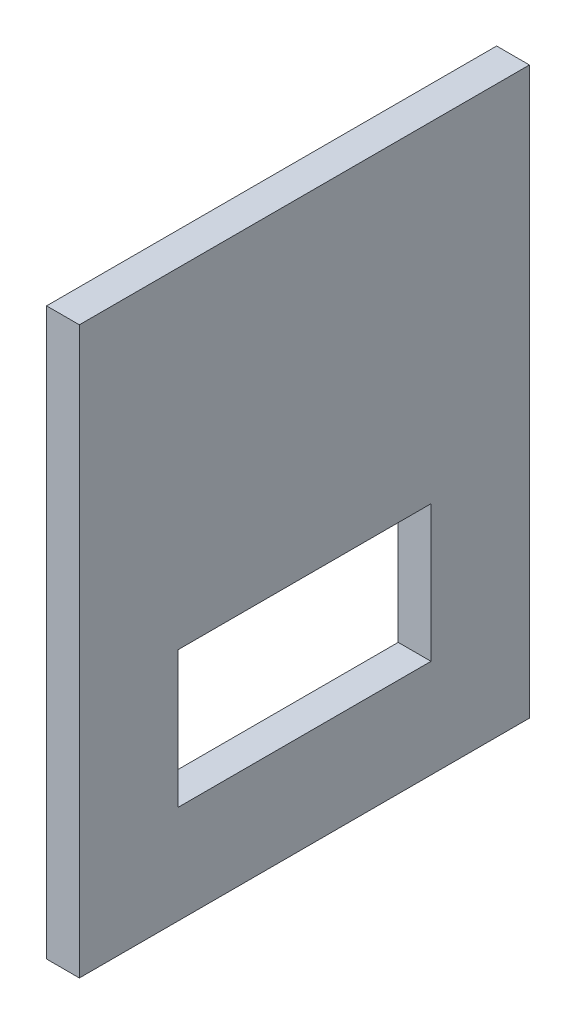
ISO-10303-21;
HEADER;
FILE_DESCRIPTION(('STEP AP214'),'2;1');
FILE_NAME('part.step','',(''),(''),'','','');
FILE_SCHEMA(('AUTOMOTIVE_DESIGN { 1 0 10303 214 1 1 1 1 }'));
ENDSEC;
DATA;
#1=APPLICATION_CONTEXT('core data for automotive mechanical design processes');
#2=APPLICATION_PROTOCOL_DEFINITION('international standard','automotive_design',2000,#1);
#3=PRODUCT_CONTEXT('',#1,'mechanical');
#4=PRODUCT('Part','Part','',(#3));
#5=PRODUCT_RELATED_PRODUCT_CATEGORY('part','',(#4));
#6=PRODUCT_DEFINITION_FORMATION('','',#4);
#7=PRODUCT_DEFINITION_CONTEXT('part definition',#1,'design');
#8=PRODUCT_DEFINITION('design','',#6,#7);
#9=PRODUCT_DEFINITION_SHAPE('','',#8);
#10=(LENGTH_UNIT() NAMED_UNIT(*) SI_UNIT(.MILLI.,.METRE.));
#11=(NAMED_UNIT(*) PLANE_ANGLE_UNIT() SI_UNIT($,.RADIAN.));
#12=(NAMED_UNIT(*) SI_UNIT($,.STERADIAN.) SOLID_ANGLE_UNIT());
#13=UNCERTAINTY_MEASURE_WITH_UNIT(LENGTH_MEASURE(1.E-05),#10,'distance_accuracy_value','');
#14=(GEOMETRIC_REPRESENTATION_CONTEXT(3) GLOBAL_UNCERTAINTY_ASSIGNED_CONTEXT((#13)) GLOBAL_UNIT_ASSIGNED_CONTEXT((#10,
#11,#12)) REPRESENTATION_CONTEXT('',''));
#15=CARTESIAN_POINT('',(0.,0.,0.));
#16=DIRECTION('',(0.,0.,1.));
#17=DIRECTION('',(1.,0.,0.));
#18=AXIS2_PLACEMENT_3D('',#15,#16,#17);
#19=CARTESIAN_POINT('',(0.,0.,68.58));
#20=DIRECTION('',(1.,0.,0.));
#21=DIRECTION('',(0.,0.,-1.));
#22=AXIS2_PLACEMENT_3D('',#19,#20,#21);
#23=PLANE('',#22);
#24=DIRECTION('',(0.,0.,1.));
#25=VECTOR('',#24,1.);
#26=CARTESIAN_POINT('',(0.,15.,15.));
#27=LINE('',#26,#25);
#28=CARTESIAN_POINT('',(0.,15.,15.));
#29=VERTEX_POINT('',#28);
#30=CARTESIAN_POINT('',(0.,15.,53.58));
#31=VERTEX_POINT('',#30);
#32=EDGE_CURVE('E124',#29,#31,#27,.T.);
#33=ORIENTED_EDGE('',*,*,#32,.F.);
#34=DIRECTION('',(0.,-1.,0.));
#35=VECTOR('',#34,1.);
#36=CARTESIAN_POINT('',(0.,15.,15.));
#37=LINE('',#36,#35);
#38=CARTESIAN_POINT('',(0.,35.8,15.));
#39=VERTEX_POINT('',#38);
#40=EDGE_CURVE('E47',#39,#29,#37,.T.);
#41=ORIENTED_EDGE('',*,*,#40,.F.);
#42=DIRECTION('',(0.,0.,-1.));
#43=VECTOR('',#42,1.);
#44=CARTESIAN_POINT('',(0.,35.8,15.));
#45=LINE('',#44,#43);
#46=CARTESIAN_POINT('',(0.,35.8,53.58));
#47=VERTEX_POINT('',#46);
#48=EDGE_CURVE('E115',#47,#39,#45,.T.);
#49=ORIENTED_EDGE('',*,*,#48,.F.);
#50=DIRECTION('',(0.,1.,0.));
#51=VECTOR('',#50,1.);
#52=CARTESIAN_POINT('',(0.,15.,53.58));
#53=LINE('',#52,#51);
#54=EDGE_CURVE('E118',#31,#47,#53,.T.);
#55=ORIENTED_EDGE('',*,*,#54,.F.);
#56=EDGE_LOOP('',(#33,#41,#49,#55));
#57=FACE_BOUND('',#56,.T.);
#58=DIRECTION('',(0.,-1.,0.));
#59=VECTOR('',#58,1.);
#60=CARTESIAN_POINT('',(0.,0.,0.));
#61=LINE('',#60,#59);
#62=CARTESIAN_POINT('',(0.,86.2,0.));
#63=VERTEX_POINT('',#62);
#64=CARTESIAN_POINT('',(0.,0.,0.));
#65=VERTEX_POINT('',#64);
#66=EDGE_CURVE('E130',#63,#65,#61,.T.);
#67=ORIENTED_EDGE('',*,*,#66,.T.);
#68=DIRECTION('',(0.,0.,-1.));
#69=VECTOR('',#68,1.);
#70=CARTESIAN_POINT('',(0.,0.,68.58));
#71=LINE('',#70,#69);
#72=CARTESIAN_POINT('',(0.,0.,68.58));
#73=VERTEX_POINT('',#72);
#74=EDGE_CURVE('E11',#73,#65,#71,.T.);
#75=ORIENTED_EDGE('',*,*,#74,.F.);
#76=DIRECTION('',(0.,-1.,0.));
#77=VECTOR('',#76,1.);
#78=CARTESIAN_POINT('',(0.,0.,68.58));
#79=LINE('',#78,#77);
#80=CARTESIAN_POINT('',(0.,86.2,68.58));
#81=VERTEX_POINT('',#80);
#82=EDGE_CURVE('E134',#81,#73,#79,.T.);
#83=ORIENTED_EDGE('',*,*,#82,.F.);
#84=DIRECTION('',(0.,0.,-1.));
#85=VECTOR('',#84,1.);
#86=CARTESIAN_POINT('',(0.,86.2,68.58));
#87=LINE('',#86,#85);
#88=EDGE_CURVE('E144',#81,#63,#87,.T.);
#89=ORIENTED_EDGE('',*,*,#88,.T.);
#90=EDGE_LOOP('',(#67,#75,#83,#89));
#91=FACE_BOUND('',#90,.T.);
#92=ADVANCED_FACE('F33',(#57,#91),#23,.F.);
#93=CARTESIAN_POINT('',(0.,0.,68.58));
#94=DIRECTION('',(0.,1.,0.));
#95=DIRECTION('',(0.,0.,1.));
#96=AXIS2_PLACEMENT_3D('',#93,#94,#95);
#97=PLANE('',#96);
#98=DIRECTION('',(1.,0.,0.));
#99=VECTOR('',#98,1.);
#100=CARTESIAN_POINT('',(0.,0.,0.));
#101=LINE('',#100,#99);
#102=CARTESIAN_POINT('',(5.,0.,0.));
#103=VERTEX_POINT('',#102);
#104=EDGE_CURVE('E147',#65,#103,#101,.T.);
#105=ORIENTED_EDGE('',*,*,#104,.T.);
#106=DIRECTION('',(0.,0.,-1.));
#107=VECTOR('',#106,1.);
#108=CARTESIAN_POINT('',(5.,0.,68.58));
#109=LINE('',#108,#107);
#110=CARTESIAN_POINT('',(5.,0.,68.58));
#111=VERTEX_POINT('',#110);
#112=EDGE_CURVE('E40',#111,#103,#109,.T.);
#113=ORIENTED_EDGE('',*,*,#112,.F.);
#114=DIRECTION('',(1.,0.,0.));
#115=VECTOR('',#114,1.);
#116=CARTESIAN_POINT('',(0.,0.,68.58));
#117=LINE('',#116,#115);
#118=EDGE_CURVE('E137',#73,#111,#117,.T.);
#119=ORIENTED_EDGE('',*,*,#118,.F.);
#120=ORIENTED_EDGE('',*,*,#74,.T.);
#121=EDGE_LOOP('',(#105,#113,#119,#120));
#122=FACE_BOUND('',#121,.T.);
#123=ADVANCED_FACE('F175',(#122),#97,.F.);
#124=CARTESIAN_POINT('',(5.,0.,68.58));
#125=DIRECTION('',(-1.,0.,0.));
#126=DIRECTION('',(0.,0.,1.));
#127=AXIS2_PLACEMENT_3D('',#124,#125,#126);
#128=PLANE('',#127);
#129=DIRECTION('',(0.,0.,-1.));
#130=VECTOR('',#129,1.);
#131=CARTESIAN_POINT('',(5.,35.8,15.));
#132=LINE('',#131,#130);
#133=CARTESIAN_POINT('',(5.,35.8,53.58));
#134=VERTEX_POINT('',#133);
#135=CARTESIAN_POINT('',(5.,35.8,15.));
#136=VERTEX_POINT('',#135);
#137=EDGE_CURVE('E105',#134,#136,#132,.T.);
#138=ORIENTED_EDGE('',*,*,#137,.T.);
#139=DIRECTION('',(0.,-1.,0.));
#140=VECTOR('',#139,1.);
#141=CARTESIAN_POINT('',(5.,15.,15.));
#142=LINE('',#141,#140);
#143=CARTESIAN_POINT('',(5.,15.,15.));
#144=VERTEX_POINT('',#143);
#145=EDGE_CURVE('E99',#136,#144,#142,.T.);
#146=ORIENTED_EDGE('',*,*,#145,.T.);
#147=DIRECTION('',(0.,0.,1.));
#148=VECTOR('',#147,1.);
#149=CARTESIAN_POINT('',(5.,15.,15.));
#150=LINE('',#149,#148);
#151=CARTESIAN_POINT('',(5.,15.,53.58));
#152=VERTEX_POINT('',#151);
#153=EDGE_CURVE('E108',#144,#152,#150,.T.);
#154=ORIENTED_EDGE('',*,*,#153,.T.);
#155=DIRECTION('',(0.,1.,0.));
#156=VECTOR('',#155,1.);
#157=CARTESIAN_POINT('',(5.,15.,53.58));
#158=LINE('',#157,#156);
#159=EDGE_CURVE('E55',#152,#134,#158,.T.);
#160=ORIENTED_EDGE('',*,*,#159,.T.);
#161=EDGE_LOOP('',(#138,#146,#154,#160));
#162=FACE_BOUND('',#161,.T.);
#163=DIRECTION('',(0.,1.,0.));
#164=VECTOR('',#163,1.);
#165=CARTESIAN_POINT('',(5.,0.,0.));
#166=LINE('',#165,#164);
#167=CARTESIAN_POINT('',(5.,86.2,0.));
#168=VERTEX_POINT('',#167);
#169=EDGE_CURVE('E149',#103,#168,#166,.T.);
#170=ORIENTED_EDGE('',*,*,#169,.T.);
#171=DIRECTION('',(0.,0.,-1.));
#172=VECTOR('',#171,1.);
#173=CARTESIAN_POINT('',(5.,86.2,68.58));
#174=LINE('',#173,#172);
#175=CARTESIAN_POINT('',(5.,86.2,68.58));
#176=VERTEX_POINT('',#175);
#177=EDGE_CURVE('E154',#176,#168,#174,.T.);
#178=ORIENTED_EDGE('',*,*,#177,.F.);
#179=DIRECTION('',(0.,1.,0.));
#180=VECTOR('',#179,1.);
#181=CARTESIAN_POINT('',(5.,0.,68.58));
#182=LINE('',#181,#180);
#183=EDGE_CURVE('E140',#111,#176,#182,.T.);
#184=ORIENTED_EDGE('',*,*,#183,.F.);
#185=ORIENTED_EDGE('',*,*,#112,.T.);
#186=EDGE_LOOP('',(#170,#178,#184,#185));
#187=FACE_BOUND('',#186,.T.);
#188=ADVANCED_FACE('F112',(#162,#187),#128,.F.);
#189=CARTESIAN_POINT('',(0.,86.2,68.58));
#190=DIRECTION('',(0.,-1.,0.));
#191=DIRECTION('',(0.,0.,-1.));
#192=AXIS2_PLACEMENT_3D('',#189,#190,#191);
#193=PLANE('',#192);
#194=DIRECTION('',(-1.,0.,0.));
#195=VECTOR('',#194,1.);
#196=CARTESIAN_POINT('',(0.,86.2,0.));
#197=LINE('',#196,#195);
#198=EDGE_CURVE('E138',#168,#63,#197,.T.);
#199=ORIENTED_EDGE('',*,*,#198,.T.);
#200=ORIENTED_EDGE('',*,*,#88,.F.);
#201=DIRECTION('',(-1.,0.,0.));
#202=VECTOR('',#201,1.);
#203=CARTESIAN_POINT('',(0.,86.2,68.58));
#204=LINE('',#203,#202);
#205=EDGE_CURVE('E142',#176,#81,#204,.T.);
#206=ORIENTED_EDGE('',*,*,#205,.F.);
#207=ORIENTED_EDGE('',*,*,#177,.T.);
#208=EDGE_LOOP('',(#199,#200,#206,#207));
#209=FACE_BOUND('',#208,.T.);
#210=ADVANCED_FACE('F168',(#209),#193,.F.);
#211=CARTESIAN_POINT('',(0.,86.2,68.58));
#212=DIRECTION('',(0.,0.,-1.));
#213=DIRECTION('',(-1.,0.,0.));
#214=AXIS2_PLACEMENT_3D('',#211,#212,#213);
#215=PLANE('',#214);
#216=ORIENTED_EDGE('',*,*,#82,.T.);
#217=ORIENTED_EDGE('',*,*,#118,.T.);
#218=ORIENTED_EDGE('',*,*,#183,.T.);
#219=ORIENTED_EDGE('',*,*,#205,.T.);
#220=EDGE_LOOP('',(#216,#217,#218,#219));
#221=FACE_BOUND('',#220,.T.);
#222=ADVANCED_FACE('F174',(#221),#215,.F.);
#223=CARTESIAN_POINT('',(0.,86.2,0.));
#224=DIRECTION('',(0.,0.,-1.));
#225=DIRECTION('',(-1.,0.,0.));
#226=AXIS2_PLACEMENT_3D('',#223,#224,#225);
#227=PLANE('',#226);
#228=ORIENTED_EDGE('',*,*,#66,.F.);
#229=ORIENTED_EDGE('',*,*,#198,.F.);
#230=ORIENTED_EDGE('',*,*,#169,.F.);
#231=ORIENTED_EDGE('',*,*,#104,.F.);
#232=EDGE_LOOP('',(#228,#229,#230,#231));
#233=FACE_BOUND('',#232,.T.);
#234=ADVANCED_FACE('F165',(#233),#227,.T.);
#235=CARTESIAN_POINT('',(5.,15.,15.));
#236=DIRECTION('',(0.,0.,-1.));
#237=DIRECTION('',(-1.,0.,0.));
#238=AXIS2_PLACEMENT_3D('',#235,#236,#237);
#239=PLANE('',#238);
#240=ORIENTED_EDGE('',*,*,#40,.T.);
#241=DIRECTION('',(-1.,0.,0.));
#242=VECTOR('',#241,1.);
#243=CARTESIAN_POINT('',(5.,15.,15.));
#244=LINE('',#243,#242);
#245=EDGE_CURVE('E95',#144,#29,#244,.T.);
#246=ORIENTED_EDGE('',*,*,#245,.F.);
#247=ORIENTED_EDGE('',*,*,#145,.F.);
#248=DIRECTION('',(-1.,0.,0.));
#249=VECTOR('',#248,1.);
#250=CARTESIAN_POINT('',(5.,35.8,15.));
#251=LINE('',#250,#249);
#252=EDGE_CURVE('E128',#136,#39,#251,.T.);
#253=ORIENTED_EDGE('',*,*,#252,.T.);
#254=EDGE_LOOP('',(#240,#246,#247,#253));
#255=FACE_BOUND('',#254,.T.);
#256=ADVANCED_FACE('F97',(#255),#239,.F.);
#257=CARTESIAN_POINT('',(5.,35.8,15.));
#258=DIRECTION('',(0.,1.,0.));
#259=DIRECTION('',(0.,0.,1.));
#260=AXIS2_PLACEMENT_3D('',#257,#258,#259);
#261=PLANE('',#260);
#262=ORIENTED_EDGE('',*,*,#48,.T.);
#263=ORIENTED_EDGE('',*,*,#252,.F.);
#264=ORIENTED_EDGE('',*,*,#137,.F.);
#265=DIRECTION('',(-1.,0.,0.));
#266=VECTOR('',#265,1.);
#267=CARTESIAN_POINT('',(5.,35.8,53.58));
#268=LINE('',#267,#266);
#269=EDGE_CURVE('E131',#134,#47,#268,.T.);
#270=ORIENTED_EDGE('',*,*,#269,.T.);
#271=EDGE_LOOP('',(#262,#263,#264,#270));
#272=FACE_BOUND('',#271,.T.);
#273=ADVANCED_FACE('F192',(#272),#261,.F.);
#274=CARTESIAN_POINT('',(5.,15.,53.58));
#275=DIRECTION('',(0.,0.,1.));
#276=DIRECTION('',(1.,0.,0.));
#277=AXIS2_PLACEMENT_3D('',#274,#275,#276);
#278=PLANE('',#277);
#279=ORIENTED_EDGE('',*,*,#54,.T.);
#280=ORIENTED_EDGE('',*,*,#269,.F.);
#281=ORIENTED_EDGE('',*,*,#159,.F.);
#282=DIRECTION('',(-1.,0.,0.));
#283=VECTOR('',#282,1.);
#284=CARTESIAN_POINT('',(5.,15.,53.58));
#285=LINE('',#284,#283);
#286=EDGE_CURVE('E104',#152,#31,#285,.T.);
#287=ORIENTED_EDGE('',*,*,#286,.T.);
#288=EDGE_LOOP('',(#279,#280,#281,#287));
#289=FACE_BOUND('',#288,.T.);
#290=ADVANCED_FACE('F195',(#289),#278,.F.);
#291=CARTESIAN_POINT('',(5.,15.,15.));
#292=DIRECTION('',(0.,-1.,0.));
#293=DIRECTION('',(0.,0.,-1.));
#294=AXIS2_PLACEMENT_3D('',#291,#292,#293);
#295=PLANE('',#294);
#296=ORIENTED_EDGE('',*,*,#32,.T.);
#297=ORIENTED_EDGE('',*,*,#286,.F.);
#298=ORIENTED_EDGE('',*,*,#153,.F.);
#299=ORIENTED_EDGE('',*,*,#245,.T.);
#300=EDGE_LOOP('',(#296,#297,#298,#299));
#301=FACE_BOUND('',#300,.T.);
#302=ADVANCED_FACE('F109',(#301),#295,.F.);
#303=CLOSED_SHELL('',(#92,#123,#188,#210,#222,#234,#256,#273,#290,#302));
#304=MANIFOLD_SOLID_BREP('B2',#303);
#305=ADVANCED_BREP_SHAPE_REPRESENTATION('',(#18,#304),#14);
#306=SHAPE_DEFINITION_REPRESENTATION(#9,#305);
ENDSEC;
END-ISO-10303-21;
